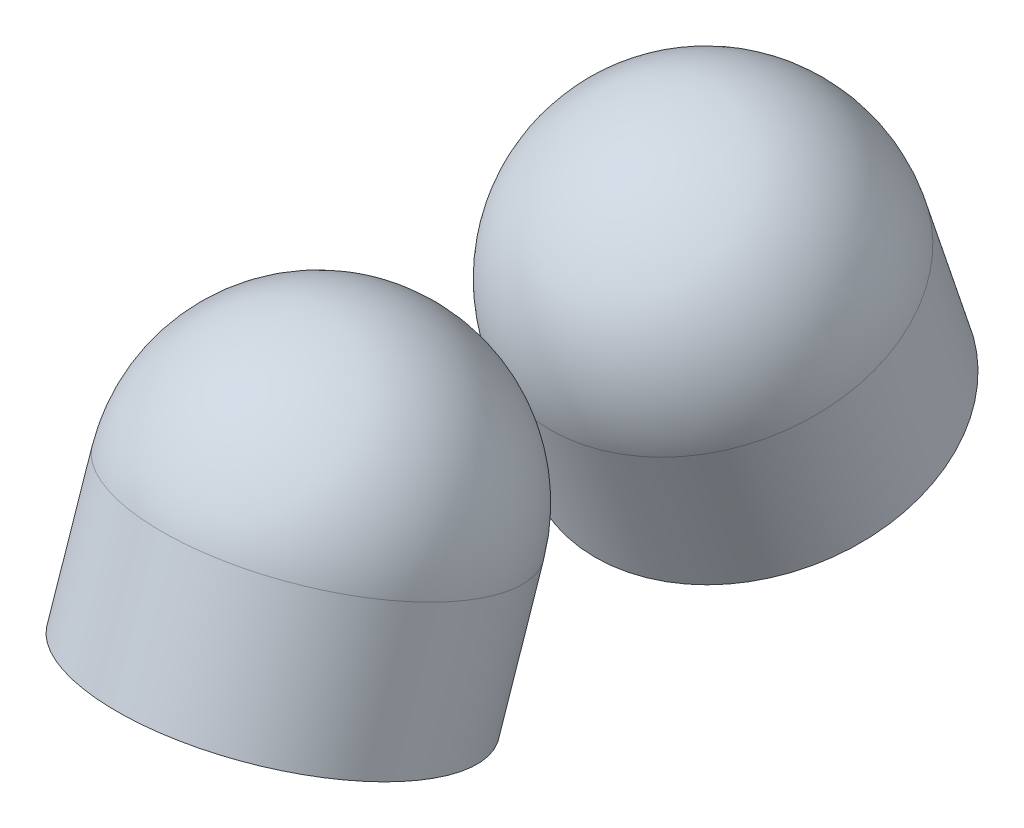
ISO-10303-21;
HEADER;
FILE_DESCRIPTION(('STEP AP214'),'2;1');
FILE_NAME('part.step','',(''),(''),'','','');
FILE_SCHEMA(('AUTOMOTIVE_DESIGN { 1 0 10303 214 1 1 1 1 }'));
ENDSEC;
DATA;
#1=APPLICATION_CONTEXT('core data for automotive mechanical design processes');
#2=APPLICATION_PROTOCOL_DEFINITION('international standard','automotive_design',2000,#1);
#3=PRODUCT_CONTEXT('',#1,'mechanical');
#4=PRODUCT('Part','Part','',(#3));
#5=PRODUCT_RELATED_PRODUCT_CATEGORY('part','',(#4));
#6=PRODUCT_DEFINITION_FORMATION('','',#4);
#7=PRODUCT_DEFINITION_CONTEXT('part definition',#1,'design');
#8=PRODUCT_DEFINITION('design','',#6,#7);
#9=PRODUCT_DEFINITION_SHAPE('','',#8);
#10=(LENGTH_UNIT() NAMED_UNIT(*) SI_UNIT(.MILLI.,.METRE.));
#11=(NAMED_UNIT(*) PLANE_ANGLE_UNIT() SI_UNIT($,.RADIAN.));
#12=(NAMED_UNIT(*) SI_UNIT($,.STERADIAN.) SOLID_ANGLE_UNIT());
#13=UNCERTAINTY_MEASURE_WITH_UNIT(LENGTH_MEASURE(1.E-05),#10,'distance_accuracy_value','');
#14=(GEOMETRIC_REPRESENTATION_CONTEXT(3) GLOBAL_UNCERTAINTY_ASSIGNED_CONTEXT((#13)) GLOBAL_UNIT_ASSIGNED_CONTEXT((#10,
#11,#12)) REPRESENTATION_CONTEXT('',''));
#15=CARTESIAN_POINT('',(0.,0.,0.));
#16=DIRECTION('',(0.,0.,1.));
#17=DIRECTION('',(1.,0.,0.));
#18=AXIS2_PLACEMENT_3D('',#15,#16,#17);
#19=CARTESIAN_POINT('',(-1.40784927518268,4.50565281732685,3.36371446345566));
#20=DIRECTION('',(0.,-0.946950170183631,0.321380421291019));
#21=DIRECTION('',(0.,-0.321380421291019,-0.946950170183631));
#22=AXIS2_PLACEMENT_3D('',#19,#20,#21);
#23=PLANE('',#22);
#24=CARTESIAN_POINT('',(0.,4.05319762415438,2.03055135272852));
#25=DIRECTION('',(0.,-0.946950170183632,0.321380421291016));
#26=DIRECTION('',(0.,-0.321380421291016,-0.946950170183632));
#27=AXIS2_PLACEMENT_3D('',#24,#25,#26);
#28=CIRCLE('',#27,1.39784927518268);
#29=CARTESIAN_POINT('',(0.,3.60395623519483,0.706857743703216));
#30=VERTEX_POINT('',#29);
#31=EDGE_CURVE('P0_E19',#30,#30,#28,.F.);
#32=ORIENTED_EDGE('',*,*,#31,.F.);
#33=EDGE_LOOP('',(#32));
#34=FACE_BOUND('',#33,.T.);
#35=ADVANCED_FACE('P0_F15',(#34),#23,.T.);
#36=CARTESIAN_POINT('',(0.,5.18256768384151,1.64726040775163));
#37=DIRECTION('',(0.,0.,1.));
#38=DIRECTION('',(-1.,0.,0.));
#39=AXIS2_PLACEMENT_3D('',#36,#37,#38);
#40=SPHERICAL_SURFACE('',#39,1.39784927518269);
#41=CARTESIAN_POINT('',(0.,5.18256768384151,1.64726040775163));
#42=DIRECTION('',(0.,-0.946950170183632,0.321380421291016));
#43=DIRECTION('',(0.,-0.321380421291016,-0.946950170183632));
#44=AXIS2_PLACEMENT_3D('',#41,#42,#43);
#45=SPHERICAL_SURFACE('',#44,1.39784927518269);
#46=CARTESIAN_POINT('',(0.,5.18256768384151,1.64726040775163));
#47=DIRECTION('',(0.,-0.946950170183632,0.321380421291016));
#48=DIRECTION('',(0.,-0.321380421291016,-0.946950170183632));
#49=AXIS2_PLACEMENT_3D('',#46,#47,#48);
#50=CIRCLE('',#49,1.39784927518268);
#51=CARTESIAN_POINT('',(0.,4.73332629488196,0.323566798726327));
#52=VERTEX_POINT('',#51);
#53=EDGE_CURVE('P0_E10',#52,#52,#50,.T.);
#54=ORIENTED_EDGE('',*,*,#53,.F.);
#55=EDGE_LOOP('',(#54));
#56=FACE_BOUND('',#55,.T.);
#57=ADVANCED_FACE('P0_F33',(#56),#45,.T.);
#58=CARTESIAN_POINT('',(0.,5.18256768384151,1.64726040775163));
#59=DIRECTION('',(0.,-0.946950170183632,0.321380421291016));
#60=DIRECTION('',(0.,-0.321380421291016,-0.946950170183632));
#61=AXIS2_PLACEMENT_3D('',#58,#59,#60);
#62=CYLINDRICAL_SURFACE('',#61,1.39784927518268);
#63=ORIENTED_EDGE('',*,*,#53,.T.);
#64=EDGE_LOOP('',(#63));
#65=FACE_BOUND('',#64,.T.);
#66=ORIENTED_EDGE('',*,*,#31,.T.);
#67=EDGE_LOOP('',(#66));
#68=FACE_BOUND('',#67,.T.);
#69=ADVANCED_FACE('P0_F17',(#65,#68),#62,.T.);
#70=CLOSED_SHELL('',(#35,#57,#69));
#71=MANIFOLD_SOLID_BREP('P0_B1',#70);
#72=CARTESIAN_POINT('',(-1.40784927518268,3.60074243098192,-0.697388242001383));
#73=DIRECTION('',(0.,-0.946950170183631,-0.321380421291019));
#74=DIRECTION('',(0.,0.321380421291019,-0.946950170183631));
#75=AXIS2_PLACEMENT_3D('',#72,#73,#74);
#76=PLANE('',#75);
#77=CARTESIAN_POINT('',(0.,4.05319762415439,-2.03055135272852));
#78=DIRECTION('',(0.,0.94695017018363,0.321380421291023));
#79=DIRECTION('',(0.,-0.321380421291023,0.94695017018363));
#80=AXIS2_PLACEMENT_3D('',#77,#78,#79);
#81=CIRCLE('',#80,1.39784927518268);
#82=CARTESIAN_POINT('',(0.,3.60395623519483,-0.706857743703219));
#83=VERTEX_POINT('',#82);
#84=EDGE_CURVE('P1_E19',#83,#83,#81,.T.);
#85=ORIENTED_EDGE('',*,*,#84,.F.);
#86=EDGE_LOOP('',(#85));
#87=FACE_BOUND('',#86,.T.);
#88=ADVANCED_FACE('P1_F15',(#87),#76,.T.);
#89=CARTESIAN_POINT('',(0.,5.18256768384151,-1.64726040775163));
#90=DIRECTION('',(0.,0.,1.));
#91=DIRECTION('',(-1.,0.,0.));
#92=AXIS2_PLACEMENT_3D('',#89,#90,#91);
#93=SPHERICAL_SURFACE('',#92,1.39784927518268);
#94=CARTESIAN_POINT('',(0.,5.18256768384151,-1.64726040775163));
#95=DIRECTION('',(0.,0.94695017018363,0.321380421291023));
#96=DIRECTION('',(0.,-0.321380421291023,0.94695017018363));
#97=AXIS2_PLACEMENT_3D('',#94,#95,#96);
#98=SPHERICAL_SURFACE('',#97,1.39784927518268);
#99=CARTESIAN_POINT('',(0.,5.18256768384152,-1.64726040775162));
#100=DIRECTION('',(0.,0.94695017018363,0.321380421291023));
#101=DIRECTION('',(0.,-0.321380421291023,0.94695017018363));
#102=AXIS2_PLACEMENT_3D('',#99,#100,#101);
#103=CIRCLE('',#102,1.39784927518268);
#104=CARTESIAN_POINT('',(0.,4.73332629488196,-0.323566798726322));
#105=VERTEX_POINT('',#104);
#106=EDGE_CURVE('P1_E11',#105,#105,#103,.F.);
#107=ORIENTED_EDGE('',*,*,#106,.F.);
#108=EDGE_LOOP('',(#107));
#109=FACE_BOUND('',#108,.T.);
#110=ADVANCED_FACE('P1_F34',(#109),#98,.T.);
#111=CARTESIAN_POINT('',(0.,4.05319762415439,-2.03055135272852));
#112=DIRECTION('',(0.,0.94695017018363,0.321380421291023));
#113=DIRECTION('',(0.,-0.321380421291023,0.94695017018363));
#114=AXIS2_PLACEMENT_3D('',#111,#112,#113);
#115=CYLINDRICAL_SURFACE('',#114,1.39784927518268);
#116=ORIENTED_EDGE('',*,*,#106,.T.);
#117=EDGE_LOOP('',(#116));
#118=FACE_BOUND('',#117,.T.);
#119=ORIENTED_EDGE('',*,*,#84,.T.);
#120=EDGE_LOOP('',(#119));
#121=FACE_BOUND('',#120,.T.);
#122=ADVANCED_FACE('P1_F17',(#118,#121),#115,.T.);
#123=CLOSED_SHELL('',(#88,#110,#122));
#124=MANIFOLD_SOLID_BREP('P1_B1',#123);
#125=ADVANCED_BREP_SHAPE_REPRESENTATION('',(#18,#71,#124),#14);
#126=SHAPE_DEFINITION_REPRESENTATION(#9,#125);
ENDSEC;
END-ISO-10303-21;
